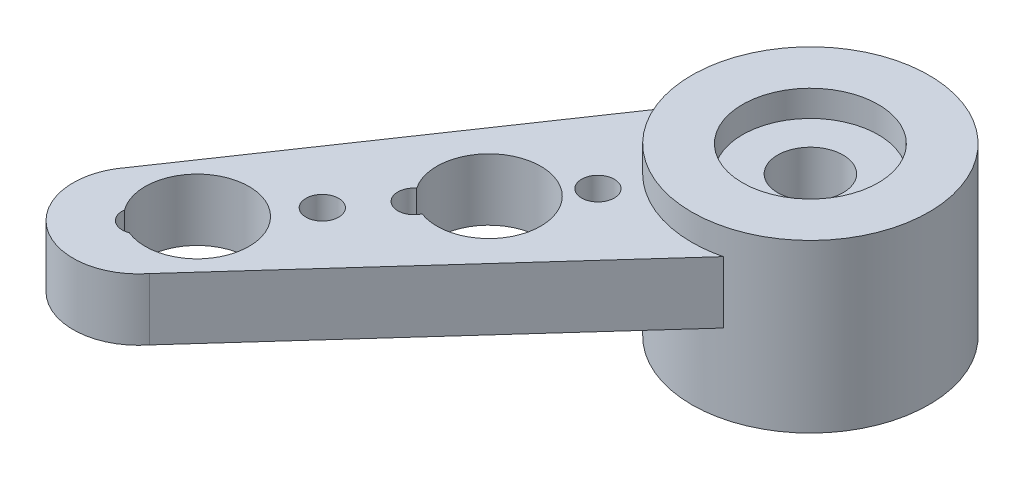
ISO-10303-21;
HEADER;
FILE_DESCRIPTION(('STEP AP214'),'2;1');
FILE_NAME('part.step','',(''),(''),'','','');
FILE_SCHEMA(('AUTOMOTIVE_DESIGN { 1 0 10303 214 1 1 1 1 }'));
ENDSEC;
DATA;
#1=APPLICATION_CONTEXT('core data for automotive mechanical design processes');
#2=APPLICATION_PROTOCOL_DEFINITION('international standard','automotive_design',2000,#1);
#3=PRODUCT_CONTEXT('',#1,'mechanical');
#4=PRODUCT('Part','Part','',(#3));
#5=PRODUCT_RELATED_PRODUCT_CATEGORY('part','',(#4));
#6=PRODUCT_DEFINITION_FORMATION('','',#4);
#7=PRODUCT_DEFINITION_CONTEXT('part definition',#1,'design');
#8=PRODUCT_DEFINITION('design','',#6,#7);
#9=PRODUCT_DEFINITION_SHAPE('','',#8);
#10=(LENGTH_UNIT() NAMED_UNIT(*) SI_UNIT(.MILLI.,.METRE.));
#11=(NAMED_UNIT(*) PLANE_ANGLE_UNIT() SI_UNIT($,.RADIAN.));
#12=(NAMED_UNIT(*) SI_UNIT($,.STERADIAN.) SOLID_ANGLE_UNIT());
#13=UNCERTAINTY_MEASURE_WITH_UNIT(LENGTH_MEASURE(1.E-05),#10,'distance_accuracy_value','');
#14=(GEOMETRIC_REPRESENTATION_CONTEXT(3) GLOBAL_UNCERTAINTY_ASSIGNED_CONTEXT((#13)) GLOBAL_UNIT_ASSIGNED_CONTEXT((#10,
#11,#12)) REPRESENTATION_CONTEXT('',''));
#15=CARTESIAN_POINT('',(0.,0.,0.));
#16=DIRECTION('',(0.,0.,1.));
#17=DIRECTION('',(1.,0.,0.));
#18=AXIS2_PLACEMENT_3D('',#15,#16,#17);
#19=CARTESIAN_POINT('',(0.,4.3,0.));
#20=DIRECTION('',(0.,1.,0.));
#21=DIRECTION('',(0.,0.,1.));
#22=AXIS2_PLACEMENT_3D('',#19,#20,#21);
#23=PLANE('',#22);
#24=CARTESIAN_POINT('',(0.,4.3,0.));
#25=DIRECTION('',(0.,1.,0.));
#26=DIRECTION('',(0.,0.,1.));
#27=AXIS2_PLACEMENT_3D('',#24,#25,#26);
#28=CIRCLE('',#27,1.);
#29=CARTESIAN_POINT('',(0.,4.3,1.));
#30=VERTEX_POINT('',#29);
#31=EDGE_CURVE('E137',#30,#30,#28,.T.);
#32=ORIENTED_EDGE('',*,*,#31,.F.);
#33=EDGE_LOOP('',(#32));
#34=FACE_BOUND('',#33,.T.);
#35=CARTESIAN_POINT('',(0.,4.3,0.));
#36=DIRECTION('',(0.,1.,0.));
#37=DIRECTION('',(0.,0.,1.));
#38=AXIS2_PLACEMENT_3D('',#35,#36,#37);
#39=CIRCLE('',#38,2.075);
#40=CARTESIAN_POINT('',(0.,4.3,2.075));
#41=VERTEX_POINT('',#40);
#42=EDGE_CURVE('E207',#41,#41,#39,.T.);
#43=ORIENTED_EDGE('',*,*,#42,.T.);
#44=EDGE_LOOP('',(#43));
#45=FACE_BOUND('',#44,.T.);
#46=ADVANCED_FACE('F37',(#34,#45),#23,.T.);
#47=CARTESIAN_POINT('',(0.,0.,0.));
#48=DIRECTION('',(0.,1.,0.));
#49=DIRECTION('',(0.,0.,1.));
#50=AXIS2_PLACEMENT_3D('',#47,#48,#49);
#51=PLANE('',#50);
#52=CARTESIAN_POINT('',(0.,0.,0.));
#53=DIRECTION('',(0.,1.,0.));
#54=DIRECTION('',(0.,0.,1.));
#55=AXIS2_PLACEMENT_3D('',#52,#53,#54);
#56=CIRCLE('',#55,3.625);
#57=CARTESIAN_POINT('',(0.,0.,3.625));
#58=VERTEX_POINT('',#57);
#59=EDGE_CURVE('E164',#58,#58,#56,.T.);
#60=ORIENTED_EDGE('',*,*,#59,.F.);
#61=EDGE_LOOP('',(#60));
#62=FACE_BOUND('',#61,.T.);
#63=CARTESIAN_POINT('',(0.,0.,0.));
#64=DIRECTION('',(0.,1.,0.));
#65=DIRECTION('',(0.,0.,1.));
#66=AXIS2_PLACEMENT_3D('',#63,#64,#65);
#67=CIRCLE('',#66,2.075);
#68=CARTESIAN_POINT('',(0.,0.,2.075));
#69=VERTEX_POINT('',#68);
#70=EDGE_CURVE('E161',#69,#69,#67,.T.);
#71=ORIENTED_EDGE('',*,*,#70,.T.);
#72=EDGE_LOOP('',(#71));
#73=FACE_BOUND('',#72,.T.);
#74=ADVANCED_FACE('F244',(#62,#73),#51,.F.);
#75=CARTESIAN_POINT('',(0.,2.41,0.));
#76=DIRECTION('',(0.,-1.,0.));
#77=DIRECTION('',(0.,0.,-1.));
#78=AXIS2_PLACEMENT_3D('',#75,#76,#77);
#79=CYLINDRICAL_SURFACE('',#78,3.625);
#80=CARTESIAN_POINT('',(0.,2.41,0.));
#81=DIRECTION('',(0.,1.,0.));
#82=DIRECTION('',(0.,0.,1.));
#83=AXIS2_PLACEMENT_3D('',#80,#81,#82);
#84=CIRCLE('',#83,3.625);
#85=CARTESIAN_POINT('',(-3.625,2.41,0.));
#86=VERTEX_POINT('',#85);
#87=CARTESIAN_POINT('',(0.859585555161717,2.41,3.52161009672526));
#88=VERTEX_POINT('',#87);
#89=EDGE_CURVE('E167',#86,#88,#84,.T.);
#90=ORIENTED_EDGE('',*,*,#89,.F.);
#91=DIRECTION('',(0.,-1.,0.));
#92=VECTOR('',#91,1.);
#93=CARTESIAN_POINT('',(-3.625,4.3,0.));
#94=LINE('',#93,#92);
#95=CARTESIAN_POINT('',(-3.625,4.3,0.));
#96=VERTEX_POINT('',#95);
#97=EDGE_CURVE('E157',#96,#86,#94,.T.);
#98=ORIENTED_EDGE('',*,*,#97,.F.);
#99=CARTESIAN_POINT('',(0.,4.3,0.));
#100=DIRECTION('',(0.,1.,0.));
#101=DIRECTION('',(0.,0.,1.));
#102=AXIS2_PLACEMENT_3D('',#99,#100,#101);
#103=CIRCLE('',#102,3.625);
#104=CARTESIAN_POINT('',(0.859585555161719,4.3,3.52161009672526));
#105=VERTEX_POINT('',#104);
#106=EDGE_CURVE('E171',#96,#105,#103,.T.);
#107=ORIENTED_EDGE('',*,*,#106,.T.);
#108=DIRECTION('',(0.,-1.,0.));
#109=VECTOR('',#108,1.);
#110=CARTESIAN_POINT('',(0.859585555161717,4.3,3.52161009672526));
#111=LINE('',#110,#109);
#112=EDGE_CURVE('E154',#105,#88,#111,.T.);
#113=ORIENTED_EDGE('',*,*,#112,.T.);
#114=EDGE_LOOP('',(#90,#98,#107,#113));
#115=FACE_BOUND('',#114,.T.);
#116=ORIENTED_EDGE('',*,*,#59,.T.);
#117=EDGE_LOOP('',(#116));
#118=FACE_BOUND('',#117,.T.);
#119=CARTESIAN_POINT('',(0.,5.1,0.));
#120=DIRECTION('',(0.,1.,0.));
#121=DIRECTION('',(0.,0.,1.));
#122=AXIS2_PLACEMENT_3D('',#119,#120,#121);
#123=CIRCLE('',#122,3.625);
#124=CARTESIAN_POINT('',(0.,5.1,3.625));
#125=VERTEX_POINT('',#124);
#126=EDGE_CURVE('E217',#125,#125,#123,.T.);
#127=ORIENTED_EDGE('',*,*,#126,.F.);
#128=EDGE_LOOP('',(#127));
#129=FACE_BOUND('',#128,.T.);
#130=ADVANCED_FACE('F39',(#115,#118,#129),#79,.T.);
#131=CARTESIAN_POINT('',(0.,2.41,0.));
#132=DIRECTION('',(0.,-1.,0.));
#133=DIRECTION('',(0.,0.,-1.));
#134=AXIS2_PLACEMENT_3D('',#131,#132,#133);
#135=CYLINDRICAL_SURFACE('',#134,2.075);
#136=CARTESIAN_POINT('',(0.,2.41,0.));
#137=DIRECTION('',(0.,1.,0.));
#138=DIRECTION('',(0.,0.,1.));
#139=AXIS2_PLACEMENT_3D('',#136,#137,#138);
#140=CIRCLE('',#139,2.075);
#141=CARTESIAN_POINT('',(0.,2.41,2.075));
#142=VERTEX_POINT('',#141);
#143=EDGE_CURVE('E158',#142,#142,#140,.T.);
#144=ORIENTED_EDGE('',*,*,#143,.T.);
#145=EDGE_LOOP('',(#144));
#146=FACE_BOUND('',#145,.T.);
#147=ORIENTED_EDGE('',*,*,#70,.F.);
#148=EDGE_LOOP('',(#147));
#149=FACE_BOUND('',#148,.T.);
#150=ADVANCED_FACE('F264',(#146,#149),#135,.F.);
#151=CARTESIAN_POINT('',(0.,2.41,0.));
#152=DIRECTION('',(0.,1.,0.));
#153=DIRECTION('',(0.,0.,1.));
#154=AXIS2_PLACEMENT_3D('',#151,#152,#153);
#155=PLANE('',#154);
#156=CARTESIAN_POINT('',(-9.03247950828862,2.41,11.5023884012124));
#157=DIRECTION('',(0.,1.,0.));
#158=DIRECTION('',(0.,0.,1.));
#159=AXIS2_PLACEMENT_3D('',#156,#157,#158);
#160=CIRCLE('',#159,0.500000000000001);
#161=CARTESIAN_POINT('',(-9.52788186217017,2.41,11.4347385100919));
#162=VERTEX_POINT('',#161);
#163=CARTESIAN_POINT('',(-8.84928578497773,2.41,11.9676195907725));
#164=VERTEX_POINT('',#163);
#165=EDGE_CURVE('E129',#162,#164,#160,.T.);
#166=ORIENTED_EDGE('',*,*,#165,.T.);
#167=CARTESIAN_POINT('',(-8.24503257679679,2.41,10.4996160790554));
#168=DIRECTION('',(0.,1.,0.));
#169=DIRECTION('',(0.,0.,1.));
#170=AXIS2_PLACEMENT_3D('',#167,#168,#169);
#171=CIRCLE('',#170,1.58750000000334);
#172=EDGE_CURVE('E199',#164,#162,#171,.T.);
#173=ORIENTED_EDGE('',*,*,#172,.T.);
#174=EDGE_LOOP('',(#166,#173));
#175=FACE_BOUND('',#174,.T.);
#176=CARTESIAN_POINT('',(-6.5620577624319,2.41,8.35643601797484));
#177=DIRECTION('',(0.,1.,0.));
#178=DIRECTION('',(0.,0.,1.));
#179=AXIS2_PLACEMENT_3D('',#176,#177,#178);
#180=CIRCLE('',#179,0.500000000000001);
#181=CARTESIAN_POINT('',(-6.5620577624319,2.41,8.85643601797484));
#182=VERTEX_POINT('',#181);
#183=EDGE_CURVE('E116',#182,#182,#180,.T.);
#184=ORIENTED_EDGE('',*,*,#183,.T.);
#185=EDGE_LOOP('',(#184));
#186=FACE_BOUND('',#185,.T.);
#187=CARTESIAN_POINT('',(-5.32684688950354,2.41,6.78345982635605));
#188=DIRECTION('',(0.,1.,0.));
#189=DIRECTION('',(0.,0.,1.));
#190=AXIS2_PLACEMENT_3D('',#187,#188,#189);
#191=CIRCLE('',#190,0.5);
#192=CARTESIAN_POINT('',(-5.63933402391442,2.41,6.39313715108893));
#193=VERTEX_POINT('',#192);
#194=CARTESIAN_POINT('',(-4.87355759264424,2.41,6.99447834059781));
#195=VERTEX_POINT('',#194);
#196=EDGE_CURVE('E117',#193,#195,#191,.T.);
#197=ORIENTED_EDGE('',*,*,#196,.T.);
#198=CARTESIAN_POINT('',(-4.32323805524925,2.41,5.50541667066578));
#199=DIRECTION('',(0.,1.,0.));
#200=DIRECTION('',(0.,0.,1.));
#201=AXIS2_PLACEMENT_3D('',#198,#199,#200);
#202=CIRCLE('',#201,1.58750000003131);
#203=EDGE_CURVE('E102',#195,#193,#202,.T.);
#204=ORIENTED_EDGE('',*,*,#203,.T.);
#205=EDGE_LOOP('',(#197,#204));
#206=FACE_BOUND('',#205,.T.);
#207=CARTESIAN_POINT('',(-2.85642514364683,2.41,3.63750744311846));
#208=DIRECTION('',(0.,1.,0.));
#209=DIRECTION('',(0.,0.,1.));
#210=AXIS2_PLACEMENT_3D('',#207,#208,#209);
#211=CIRCLE('',#210,0.5);
#212=CARTESIAN_POINT('',(-2.85642514364683,2.41,4.13750744311846));
#213=VERTEX_POINT('',#212);
#214=EDGE_CURVE('E125',#213,#213,#211,.T.);
#215=ORIENTED_EDGE('',*,*,#214,.T.);
#216=EDGE_LOOP('',(#215));
#217=FACE_BOUND('',#216,.T.);
#218=DIRECTION('',(-0.562242548605768,0.,0.826972379549215));
#219=VECTOR('',#218,1.);
#220=CARTESIAN_POINT('',(-10.6054556999074,2.41,10.2671775282841));
#221=LINE('',#220,#219);
#222=CARTESIAN_POINT('',(-10.6054556999074,2.41,10.2671775282841));
#223=VERTEX_POINT('',#222);
#224=EDGE_CURVE('E140',#86,#223,#221,.T.);
#225=ORIENTED_EDGE('',*,*,#224,.F.);
#226=ORIENTED_EDGE('',*,*,#89,.T.);
#227=DIRECTION('',(0.670063091932306,0.,-0.742304151160505));
#228=VECTOR('',#227,1.);
#229=CARTESIAN_POINT('',(-7.45950331666982,2.41,12.7375992741408));
#230=LINE('',#229,#228);
#231=CARTESIAN_POINT('',(-7.45950331666982,2.41,12.7375992741408));
#232=VERTEX_POINT('',#231);
#233=EDGE_CURVE('E149',#232,#88,#230,.T.);
#234=ORIENTED_EDGE('',*,*,#233,.F.);
#235=CARTESIAN_POINT('',(-9.03247950828862,2.41,11.5023884012124));
#236=DIRECTION('',(0.,1.,0.));
#237=DIRECTION('',(0.,0.,1.));
#238=AXIS2_PLACEMENT_3D('',#235,#236,#237);
#239=CIRCLE('',#238,2.);
#240=EDGE_CURVE('E147',#223,#232,#239,.T.);
#241=ORIENTED_EDGE('',*,*,#240,.F.);
#242=EDGE_LOOP('',(#225,#226,#234,#241));
#243=FACE_BOUND('',#242,.T.);
#244=ADVANCED_FACE('F205',(#175,#186,#206,#217,#243),#155,.F.);
#245=CARTESIAN_POINT('',(-8.24503257679679,4.3,10.4996160790554));
#246=DIRECTION('',(0.,1.,0.));
#247=DIRECTION('',(0.,0.,1.));
#248=AXIS2_PLACEMENT_3D('',#245,#246,#247);
#249=CIRCLE('',#248,1.58750000000334);
#250=CARTESIAN_POINT('',(-8.84928578497773,4.3,11.9676195907725));
#251=VERTEX_POINT('',#250);
#252=CARTESIAN_POINT('',(-9.52788186217017,4.3,11.4347385100919));
#253=VERTEX_POINT('',#252);
#254=EDGE_CURVE('E51',#251,#253,#249,.T.);
#255=ORIENTED_EDGE('',*,*,#254,.F.);
#256=CARTESIAN_POINT('',(-9.03247950828862,4.3,11.5023884012124));
#257=DIRECTION('',(0.,1.,0.));
#258=DIRECTION('',(0.,0.,1.));
#259=AXIS2_PLACEMENT_3D('',#256,#257,#258);
#260=CIRCLE('',#259,0.500000000000001);
#261=EDGE_CURVE('E131',#253,#251,#260,.T.);
#262=ORIENTED_EDGE('',*,*,#261,.F.);
#263=EDGE_LOOP('',(#255,#262));
#264=FACE_BOUND('',#263,.T.);
#265=CARTESIAN_POINT('',(-4.32323805524925,4.3,5.50541667066578));
#266=DIRECTION('',(0.,1.,0.));
#267=DIRECTION('',(0.,0.,1.));
#268=AXIS2_PLACEMENT_3D('',#265,#266,#267);
#269=CIRCLE('',#268,1.58750000003131);
#270=CARTESIAN_POINT('',(-4.87355759264424,4.3,6.99447834059781));
#271=VERTEX_POINT('',#270);
#272=CARTESIAN_POINT('',(-5.63933402391442,4.3,6.39313715108893));
#273=VERTEX_POINT('',#272);
#274=EDGE_CURVE('E59',#271,#273,#269,.T.);
#275=ORIENTED_EDGE('',*,*,#274,.F.);
#276=CARTESIAN_POINT('',(-5.32684688950354,4.3,6.78345982635605));
#277=DIRECTION('',(0.,1.,0.));
#278=DIRECTION('',(0.,0.,1.));
#279=AXIS2_PLACEMENT_3D('',#276,#277,#278);
#280=CIRCLE('',#279,0.5);
#281=EDGE_CURVE('E113',#273,#271,#280,.T.);
#282=ORIENTED_EDGE('',*,*,#281,.F.);
#283=EDGE_LOOP('',(#275,#282));
#284=FACE_BOUND('',#283,.T.);
#285=ORIENTED_EDGE('',*,*,#106,.F.);
#286=DIRECTION('',(-0.562242548605768,0.,0.826972379549215));
#287=VECTOR('',#286,1.);
#288=CARTESIAN_POINT('',(-10.6054556999074,4.3,10.2671775282841));
#289=LINE('',#288,#287);
#290=CARTESIAN_POINT('',(-10.6054556999074,4.3,10.2671775282841));
#291=VERTEX_POINT('',#290);
#292=EDGE_CURVE('E146',#96,#291,#289,.T.);
#293=ORIENTED_EDGE('',*,*,#292,.T.);
#294=CARTESIAN_POINT('',(-9.03247950828862,4.3,11.5023884012124));
#295=DIRECTION('',(0.,1.,0.));
#296=DIRECTION('',(0.,0.,1.));
#297=AXIS2_PLACEMENT_3D('',#294,#295,#296);
#298=CIRCLE('',#297,2.);
#299=CARTESIAN_POINT('',(-7.45950331666982,4.3,12.7375992741408));
#300=VERTEX_POINT('',#299);
#301=EDGE_CURVE('E143',#291,#300,#298,.T.);
#302=ORIENTED_EDGE('',*,*,#301,.T.);
#303=DIRECTION('',(0.670063091932306,0.,-0.742304151160505));
#304=VECTOR('',#303,1.);
#305=CARTESIAN_POINT('',(-7.45950331666982,4.3,12.7375992741408));
#306=LINE('',#305,#304);
#307=EDGE_CURVE('E145',#300,#105,#306,.T.);
#308=ORIENTED_EDGE('',*,*,#307,.T.);
#309=EDGE_LOOP('',(#285,#293,#302,#308));
#310=FACE_BOUND('',#309,.T.);
#311=CARTESIAN_POINT('',(-6.5620577624319,4.3,8.35643601797484));
#312=DIRECTION('',(0.,1.,0.));
#313=DIRECTION('',(0.,0.,1.));
#314=AXIS2_PLACEMENT_3D('',#311,#312,#313);
#315=CIRCLE('',#314,0.500000000000001);
#316=CARTESIAN_POINT('',(-6.5620577624319,4.3,8.85643601797484));
#317=VERTEX_POINT('',#316);
#318=EDGE_CURVE('E120',#317,#317,#315,.T.);
#319=ORIENTED_EDGE('',*,*,#318,.F.);
#320=EDGE_LOOP('',(#319));
#321=FACE_BOUND('',#320,.T.);
#322=CARTESIAN_POINT('',(-2.85642514364683,4.3,3.63750744311846));
#323=DIRECTION('',(0.,1.,0.));
#324=DIRECTION('',(0.,0.,1.));
#325=AXIS2_PLACEMENT_3D('',#322,#323,#324);
#326=CIRCLE('',#325,0.5);
#327=CARTESIAN_POINT('',(-2.85642514364683,4.3,4.13750744311846));
#328=VERTEX_POINT('',#327);
#329=EDGE_CURVE('E122',#328,#328,#326,.T.);
#330=ORIENTED_EDGE('',*,*,#329,.F.);
#331=EDGE_LOOP('',(#330));
#332=FACE_BOUND('',#331,.T.);
#333=ADVANCED_FACE('F111',(#264,#284,#310,#321,#332),#23,.T.);
#334=ORIENTED_EDGE('',*,*,#143,.F.);
#335=EDGE_LOOP('',(#334));
#336=FACE_BOUND('',#335,.T.);
#337=CARTESIAN_POINT('',(0.,2.41,0.));
#338=DIRECTION('',(0.,1.,0.));
#339=DIRECTION('',(0.,0.,1.));
#340=AXIS2_PLACEMENT_3D('',#337,#338,#339);
#341=CIRCLE('',#340,1.);
#342=CARTESIAN_POINT('',(0.,2.41,1.));
#343=VERTEX_POINT('',#342);
#344=EDGE_CURVE('E134',#343,#343,#341,.T.);
#345=ORIENTED_EDGE('',*,*,#344,.T.);
#346=EDGE_LOOP('',(#345));
#347=FACE_BOUND('',#346,.T.);
#348=ADVANCED_FACE('F256',(#336,#347),#155,.F.);
#349=CARTESIAN_POINT('',(-10.6054556999074,4.3,10.2671775282841));
#350=DIRECTION('',(0.826972379549215,0.,0.562242548605768));
#351=DIRECTION('',(0.562242548605768,0.,-0.826972379549215));
#352=AXIS2_PLACEMENT_3D('',#349,#350,#351);
#353=PLANE('',#352);
#354=ORIENTED_EDGE('',*,*,#224,.T.);
#355=DIRECTION('',(0.,-1.,0.));
#356=VECTOR('',#355,1.);
#357=CARTESIAN_POINT('',(-10.6054556999074,4.3,10.2671775282841));
#358=LINE('',#357,#356);
#359=EDGE_CURVE('E153',#291,#223,#358,.T.);
#360=ORIENTED_EDGE('',*,*,#359,.F.);
#361=ORIENTED_EDGE('',*,*,#292,.F.);
#362=ORIENTED_EDGE('',*,*,#97,.T.);
#363=EDGE_LOOP('',(#354,#360,#361,#362));
#364=FACE_BOUND('',#363,.T.);
#365=ADVANCED_FACE('F262',(#364),#353,.F.);
#366=CARTESIAN_POINT('',(-9.03247950828862,4.3,11.5023884012124));
#367=DIRECTION('',(0.,-1.,0.));
#368=DIRECTION('',(0.,0.,-1.));
#369=AXIS2_PLACEMENT_3D('',#366,#367,#368);
#370=CYLINDRICAL_SURFACE('',#369,2.);
#371=ORIENTED_EDGE('',*,*,#240,.T.);
#372=DIRECTION('',(0.,-1.,0.));
#373=VECTOR('',#372,1.);
#374=CARTESIAN_POINT('',(-7.45950331666982,4.3,12.7375992741408));
#375=LINE('',#374,#373);
#376=EDGE_CURVE('E150',#300,#232,#375,.T.);
#377=ORIENTED_EDGE('',*,*,#376,.F.);
#378=ORIENTED_EDGE('',*,*,#301,.F.);
#379=ORIENTED_EDGE('',*,*,#359,.T.);
#380=EDGE_LOOP('',(#371,#377,#378,#379));
#381=FACE_BOUND('',#380,.T.);
#382=ADVANCED_FACE('F276',(#381),#370,.T.);
#383=CARTESIAN_POINT('',(-7.45950331666982,4.3,12.7375992741408));
#384=DIRECTION('',(-0.742304151160505,0.,-0.670063091932306));
#385=DIRECTION('',(-0.670063091932306,0.,0.742304151160505));
#386=AXIS2_PLACEMENT_3D('',#383,#384,#385);
#387=PLANE('',#386);
#388=ORIENTED_EDGE('',*,*,#233,.T.);
#389=ORIENTED_EDGE('',*,*,#112,.F.);
#390=ORIENTED_EDGE('',*,*,#307,.F.);
#391=ORIENTED_EDGE('',*,*,#376,.T.);
#392=EDGE_LOOP('',(#388,#389,#390,#391));
#393=FACE_BOUND('',#392,.T.);
#394=ADVANCED_FACE('F272',(#393),#387,.F.);
#395=CARTESIAN_POINT('',(0.,4.3,0.));
#396=DIRECTION('',(0.,-1.,0.));
#397=DIRECTION('',(0.,0.,-1.));
#398=AXIS2_PLACEMENT_3D('',#395,#396,#397);
#399=CYLINDRICAL_SURFACE('',#398,1.);
#400=ORIENTED_EDGE('',*,*,#31,.T.);
#401=EDGE_LOOP('',(#400));
#402=FACE_BOUND('',#401,.T.);
#403=ORIENTED_EDGE('',*,*,#344,.F.);
#404=EDGE_LOOP('',(#403));
#405=FACE_BOUND('',#404,.T.);
#406=ADVANCED_FACE('F275',(#402,#405),#399,.F.);
#407=CARTESIAN_POINT('',(-9.03247950828862,4.3,11.5023884012124));
#408=DIRECTION('',(0.,-1.,0.));
#409=DIRECTION('',(0.,0.,-1.));
#410=AXIS2_PLACEMENT_3D('',#407,#408,#409);
#411=CYLINDRICAL_SURFACE('',#410,0.500000000000001);
#412=DIRECTION('',(0.,1.,0.));
#413=VECTOR('',#412,1.);
#414=CARTESIAN_POINT('',(-8.84928578497773,2.15,11.9676195907725));
#415=LINE('',#414,#413);
#416=EDGE_CURVE('E11',#164,#251,#415,.T.);
#417=ORIENTED_EDGE('',*,*,#416,.F.);
#418=ORIENTED_EDGE('',*,*,#165,.F.);
#419=DIRECTION('',(0.,1.,0.));
#420=VECTOR('',#419,1.);
#421=CARTESIAN_POINT('',(-9.52788186217017,2.15,11.4347385100919));
#422=LINE('',#421,#420);
#423=EDGE_CURVE('E45',#253,#162,#422,.F.);
#424=ORIENTED_EDGE('',*,*,#423,.F.);
#425=ORIENTED_EDGE('',*,*,#261,.T.);
#426=EDGE_LOOP('',(#417,#418,#424,#425));
#427=FACE_BOUND('',#426,.T.);
#428=ADVANCED_FACE('F209',(#427),#411,.F.);
#429=CARTESIAN_POINT('',(-6.5620577624319,4.3,8.35643601797484));
#430=DIRECTION('',(0.,-1.,0.));
#431=DIRECTION('',(0.,0.,-1.));
#432=AXIS2_PLACEMENT_3D('',#429,#430,#431);
#433=CYLINDRICAL_SURFACE('',#432,0.500000000000001);
#434=ORIENTED_EDGE('',*,*,#318,.T.);
#435=EDGE_LOOP('',(#434));
#436=FACE_BOUND('',#435,.T.);
#437=ORIENTED_EDGE('',*,*,#183,.F.);
#438=EDGE_LOOP('',(#437));
#439=FACE_BOUND('',#438,.T.);
#440=ADVANCED_FACE('F241',(#436,#439),#433,.F.);
#441=CARTESIAN_POINT('',(-5.32684688950354,4.3,6.78345982635605));
#442=DIRECTION('',(0.,-1.,0.));
#443=DIRECTION('',(0.,0.,-1.));
#444=AXIS2_PLACEMENT_3D('',#441,#442,#443);
#445=CYLINDRICAL_SURFACE('',#444,0.5);
#446=DIRECTION('',(0.,1.,0.));
#447=VECTOR('',#446,1.);
#448=CARTESIAN_POINT('',(-4.87355759264424,2.15,6.99447834059781));
#449=LINE('',#448,#447);
#450=EDGE_CURVE('E99',#195,#271,#449,.T.);
#451=ORIENTED_EDGE('',*,*,#450,.F.);
#452=ORIENTED_EDGE('',*,*,#196,.F.);
#453=DIRECTION('',(0.,1.,0.));
#454=VECTOR('',#453,1.);
#455=CARTESIAN_POINT('',(-5.63933402391442,2.15,6.39313715108893));
#456=LINE('',#455,#454);
#457=EDGE_CURVE('E107',#273,#193,#456,.F.);
#458=ORIENTED_EDGE('',*,*,#457,.F.);
#459=ORIENTED_EDGE('',*,*,#281,.T.);
#460=EDGE_LOOP('',(#451,#452,#458,#459));
#461=FACE_BOUND('',#460,.T.);
#462=ADVANCED_FACE('F115',(#461),#445,.F.);
#463=CARTESIAN_POINT('',(-2.85642514364683,4.3,3.63750744311846));
#464=DIRECTION('',(0.,-1.,0.));
#465=DIRECTION('',(0.,0.,-1.));
#466=AXIS2_PLACEMENT_3D('',#463,#464,#465);
#467=CYLINDRICAL_SURFACE('',#466,0.5);
#468=ORIENTED_EDGE('',*,*,#329,.T.);
#469=EDGE_LOOP('',(#468));
#470=FACE_BOUND('',#469,.T.);
#471=ORIENTED_EDGE('',*,*,#214,.F.);
#472=EDGE_LOOP('',(#471));
#473=FACE_BOUND('',#472,.T.);
#474=ADVANCED_FACE('F229',(#470,#473),#467,.F.);
#475=CARTESIAN_POINT('',(0.,5.1,0.));
#476=DIRECTION('',(0.,1.,0.));
#477=DIRECTION('',(0.,0.,1.));
#478=AXIS2_PLACEMENT_3D('',#475,#476,#477);
#479=PLANE('',#478);
#480=ORIENTED_EDGE('',*,*,#126,.T.);
#481=EDGE_LOOP('',(#480));
#482=FACE_BOUND('',#481,.T.);
#483=CARTESIAN_POINT('',(0.,5.1,0.));
#484=DIRECTION('',(0.,1.,0.));
#485=DIRECTION('',(0.,0.,1.));
#486=AXIS2_PLACEMENT_3D('',#483,#484,#485);
#487=CIRCLE('',#486,2.075);
#488=CARTESIAN_POINT('',(0.,5.1,2.075));
#489=VERTEX_POINT('',#488);
#490=EDGE_CURVE('E214',#489,#489,#487,.T.);
#491=ORIENTED_EDGE('',*,*,#490,.F.);
#492=EDGE_LOOP('',(#491));
#493=FACE_BOUND('',#492,.T.);
#494=ADVANCED_FACE('F231',(#482,#493),#479,.T.);
#495=CARTESIAN_POINT('',(0.,5.1,0.));
#496=DIRECTION('',(0.,-1.,0.));
#497=DIRECTION('',(0.,0.,-1.));
#498=AXIS2_PLACEMENT_3D('',#495,#496,#497);
#499=CYLINDRICAL_SURFACE('',#498,2.075);
#500=ORIENTED_EDGE('',*,*,#490,.T.);
#501=EDGE_LOOP('',(#500));
#502=FACE_BOUND('',#501,.T.);
#503=ORIENTED_EDGE('',*,*,#42,.F.);
#504=EDGE_LOOP('',(#503));
#505=FACE_BOUND('',#504,.T.);
#506=ADVANCED_FACE('F237',(#502,#505),#499,.F.);
#507=CARTESIAN_POINT('',(-4.32323805524925,0.,5.50541667066578));
#508=DIRECTION('',(0.,1.,0.));
#509=DIRECTION('',(0.,0.,1.));
#510=AXIS2_PLACEMENT_3D('',#507,#508,#509);
#511=CYLINDRICAL_SURFACE('',#510,1.58750000003131);
#512=ORIENTED_EDGE('',*,*,#450,.T.);
#513=ORIENTED_EDGE('',*,*,#274,.T.);
#514=ORIENTED_EDGE('',*,*,#457,.T.);
#515=ORIENTED_EDGE('',*,*,#203,.F.);
#516=EDGE_LOOP('',(#512,#513,#514,#515));
#517=FACE_BOUND('',#516,.T.);
#518=ADVANCED_FACE('F100',(#517),#511,.F.);
#519=CARTESIAN_POINT('',(-8.24503257679679,0.,10.4996160790554));
#520=DIRECTION('',(0.,1.,0.));
#521=DIRECTION('',(0.,0.,1.));
#522=AXIS2_PLACEMENT_3D('',#519,#520,#521);
#523=CYLINDRICAL_SURFACE('',#522,1.58750000000334);
#524=ORIENTED_EDGE('',*,*,#416,.T.);
#525=ORIENTED_EDGE('',*,*,#254,.T.);
#526=ORIENTED_EDGE('',*,*,#423,.T.);
#527=ORIENTED_EDGE('',*,*,#172,.F.);
#528=EDGE_LOOP('',(#524,#525,#526,#527));
#529=FACE_BOUND('',#528,.T.);
#530=ADVANCED_FACE('F198',(#529),#523,.F.);
#531=CLOSED_SHELL('',(#46,#74,#130,#150,#244,#333,#348,#365,#382,#394,#406,#428,#440,#462,#474,
#494,#506,#518,#530));
#532=MANIFOLD_SOLID_BREP('B2',#531);
#533=ADVANCED_BREP_SHAPE_REPRESENTATION('',(#18,#532),#14);
#534=SHAPE_DEFINITION_REPRESENTATION(#9,#533);
ENDSEC;
END-ISO-10303-21;
